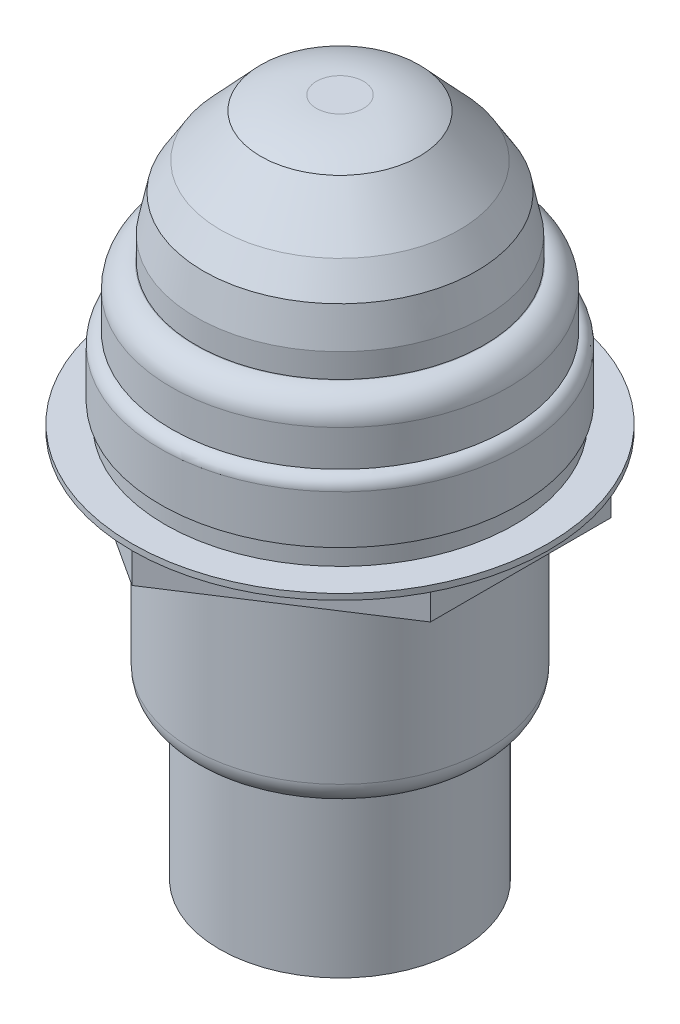
ISO-10303-21;
HEADER;
FILE_DESCRIPTION(('STEP AP214'),'2;1');
FILE_NAME('part.step','',(''),(''),'','','');
FILE_SCHEMA(('AUTOMOTIVE_DESIGN { 1 0 10303 214 1 1 1 1 }'));
ENDSEC;
DATA;
#1=APPLICATION_CONTEXT('core data for automotive mechanical design processes');
#2=APPLICATION_PROTOCOL_DEFINITION('international standard','automotive_design',2000,#1);
#3=PRODUCT_CONTEXT('',#1,'mechanical');
#4=PRODUCT('Part','Part','',(#3));
#5=PRODUCT_RELATED_PRODUCT_CATEGORY('part','',(#4));
#6=PRODUCT_DEFINITION_FORMATION('','',#4);
#7=PRODUCT_DEFINITION_CONTEXT('part definition',#1,'design');
#8=PRODUCT_DEFINITION('design','',#6,#7);
#9=PRODUCT_DEFINITION_SHAPE('','',#8);
#10=(LENGTH_UNIT() NAMED_UNIT(*) SI_UNIT(.MILLI.,.METRE.));
#11=(NAMED_UNIT(*) PLANE_ANGLE_UNIT() SI_UNIT($,.RADIAN.));
#12=(NAMED_UNIT(*) SI_UNIT($,.STERADIAN.) SOLID_ANGLE_UNIT());
#13=UNCERTAINTY_MEASURE_WITH_UNIT(LENGTH_MEASURE(1.E-05),#10,'distance_accuracy_value','');
#14=(GEOMETRIC_REPRESENTATION_CONTEXT(3) GLOBAL_UNCERTAINTY_ASSIGNED_CONTEXT((#13)) GLOBAL_UNIT_ASSIGNED_CONTEXT((#10,
#11,#12)) REPRESENTATION_CONTEXT('',''));
#15=CARTESIAN_POINT('',(0.,0.,0.));
#16=DIRECTION('',(0.,0.,1.));
#17=DIRECTION('',(1.,0.,0.));
#18=AXIS2_PLACEMENT_3D('',#15,#16,#17);
#19=CARTESIAN_POINT('',(0.,-12.3063,0.));
#20=DIRECTION('',(0.,-1.,0.));
#21=DIRECTION('',(0.,0.,-1.));
#22=AXIS2_PLACEMENT_3D('',#19,#20,#21);
#23=PLANE('',#22);
#24=DIRECTION('',(0.,0.,-1.));
#25=VECTOR('',#24,1.);
#26=CARTESIAN_POINT('',(-15.24,-12.3063,7.62));
#27=LINE('',#26,#25);
#28=CARTESIAN_POINT('',(-15.24,-12.3063,7.62));
#29=VERTEX_POINT('',#28);
#30=CARTESIAN_POINT('',(-15.24,-12.3063,-7.59799288356917));
#31=VERTEX_POINT('',#30);
#32=EDGE_CURVE('E55',#29,#31,#27,.T.);
#33=ORIENTED_EDGE('',*,*,#32,.F.);
#34=DIRECTION('',(-0.838443616300637,0.,-0.544988350595414));
#35=VECTOR('',#34,1.);
#36=CARTESIAN_POINT('',(-15.24,-12.3063,7.62));
#37=LINE('',#36,#35);
#38=CARTESIAN_POINT('',(0.,-12.3063,17.526));
#39=VERTEX_POINT('',#38);
#40=EDGE_CURVE('E138',#39,#29,#37,.T.);
#41=ORIENTED_EDGE('',*,*,#40,.F.);
#42=CARTESIAN_POINT('',(0.,-12.3063,0.));
#43=DIRECTION('',(0.,-1.,0.));
#44=DIRECTION('',(0.,0.,-1.));
#45=AXIS2_PLACEMENT_3D('',#42,#43,#44);
#46=CIRCLE('',#45,17.526);
#47=CARTESIAN_POINT('',(0.,-12.3063,-17.526));
#48=VERTEX_POINT('',#47);
#49=EDGE_CURVE('E144',#39,#48,#46,.T.);
#50=ORIENTED_EDGE('',*,*,#49,.T.);
#51=DIRECTION('',(0.837890310531416,0.,-0.545838646046217));
#52=VECTOR('',#51,1.);
#53=CARTESIAN_POINT('',(-15.24,-12.3063,-7.59799288356917));
#54=LINE('',#53,#52);
#55=EDGE_CURVE('E236',#31,#48,#54,.T.);
#56=ORIENTED_EDGE('',*,*,#55,.F.);
#57=EDGE_LOOP('',(#33,#41,#50,#56));
#58=FACE_BOUND('',#57,.T.);
#59=ADVANCED_FACE('F40',(#58),#23,.T.);
#60=CARTESIAN_POINT('',(0.,-10.16,0.));
#61=DIRECTION('',(0.,1.,0.));
#62=DIRECTION('',(0.,0.,1.));
#63=AXIS2_PLACEMENT_3D('',#60,#61,#62);
#64=CYLINDRICAL_SURFACE('',#63,15.1212575526819);
#65=DIRECTION('',(0.,1.,0.));
#66=VECTOR('',#65,1.);
#67=CARTESIAN_POINT('',(-15.1212575526819,-10.16,0.));
#68=LINE('',#67,#66);
#69=CARTESIAN_POINT('',(-15.1212575526819,-6.08903727939304,0.));
#70=VERTEX_POINT('',#69);
#71=CARTESIAN_POINT('',(-15.1212575526819,-10.16,0.));
#72=VERTEX_POINT('',#71);
#73=EDGE_CURVE('E182',#70,#72,#68,.F.);
#74=ORIENTED_EDGE('',*,*,#73,.F.);
#75=CARTESIAN_POINT('',(0.,-6.08903727939304,0.));
#76=DIRECTION('',(0.,1.,0.));
#77=DIRECTION('',(0.,0.,1.));
#78=AXIS2_PLACEMENT_3D('',#75,#76,#77);
#79=CIRCLE('',#78,15.1212575526819);
#80=CARTESIAN_POINT('',(-15.1207242212316,-6.08903727939304,0.127));
#81=VERTEX_POINT('',#80);
#82=EDGE_CURVE('E214',#70,#81,#79,.F.);
#83=ORIENTED_EDGE('',*,*,#82,.T.);
#84=DIRECTION('',(0.,1.,0.));
#85=VECTOR('',#84,1.);
#86=CARTESIAN_POINT('',(-15.1207242212316,-10.16,0.127));
#87=LINE('',#86,#85);
#88=CARTESIAN_POINT('',(-15.1207242212316,-10.16,0.127));
#89=VERTEX_POINT('',#88);
#90=EDGE_CURVE('E179',#89,#81,#87,.T.);
#91=ORIENTED_EDGE('',*,*,#90,.F.);
#92=CARTESIAN_POINT('',(0.,-10.16,0.));
#93=DIRECTION('',(0.,-1.,0.));
#94=DIRECTION('',(0.,0.,-1.));
#95=AXIS2_PLACEMENT_3D('',#92,#93,#94);
#96=CIRCLE('',#95,15.1212575526819);
#97=EDGE_CURVE('E184',#72,#89,#96,.T.);
#98=ORIENTED_EDGE('',*,*,#97,.F.);
#99=EDGE_LOOP('',(#74,#83,#91,#98));
#100=FACE_BOUND('',#99,.T.);
#101=ADVANCED_FACE('F282',(#100),#64,.T.);
#102=CARTESIAN_POINT('',(0.,-10.16,0.));
#103=DIRECTION('',(0.,-1.,0.));
#104=DIRECTION('',(0.,0.,-1.));
#105=AXIS2_PLACEMENT_3D('',#102,#103,#104);
#106=PLANE('',#105);
#107=CARTESIAN_POINT('',(0.,-10.16,0.));
#108=DIRECTION('',(0.,-1.,0.));
#109=DIRECTION('',(0.,0.,-1.));
#110=AXIS2_PLACEMENT_3D('',#107,#108,#109);
#111=CIRCLE('',#110,14.74025754);
#112=CARTESIAN_POINT('',(0.,-10.16,14.74025754));
#113=VERTEX_POINT('',#112);
#114=EDGE_CURVE('E156',#113,#113,#111,.T.);
#115=ORIENTED_EDGE('',*,*,#114,.F.);
#116=EDGE_LOOP('',(#115));
#117=FACE_BOUND('',#116,.T.);
#118=DIRECTION('',(0.,0.,-1.));
#119=VECTOR('',#118,1.);
#120=CARTESIAN_POINT('',(-14.986,-10.16,0.));
#121=LINE('',#120,#119);
#122=CARTESIAN_POINT('',(-14.986,-10.16,0.127));
#123=VERTEX_POINT('',#122);
#124=CARTESIAN_POINT('',(-14.986,-10.16,0.));
#125=VERTEX_POINT('',#124);
#126=EDGE_CURVE('E155',#123,#125,#121,.T.);
#127=ORIENTED_EDGE('',*,*,#126,.T.);
#128=DIRECTION('',(-1.,0.,0.));
#129=VECTOR('',#128,1.);
#130=CARTESIAN_POINT('',(-14.986,-10.16,0.));
#131=LINE('',#130,#129);
#132=EDGE_CURVE('E176',#125,#72,#131,.T.);
#133=ORIENTED_EDGE('',*,*,#132,.T.);
#134=ORIENTED_EDGE('',*,*,#97,.T.);
#135=DIRECTION('',(-1.,0.,0.));
#136=VECTOR('',#135,1.);
#137=CARTESIAN_POINT('',(-14.986,-10.16,0.127));
#138=LINE('',#137,#136);
#139=EDGE_CURVE('E169',#123,#89,#138,.T.);
#140=ORIENTED_EDGE('',*,*,#139,.F.);
#141=EDGE_LOOP('',(#127,#133,#134,#140));
#142=FACE_BOUND('',#141,.T.);
#143=ADVANCED_FACE('F286',(#117,#142),#106,.T.);
#144=CARTESIAN_POINT('',(0.,6.096,0.));
#145=DIRECTION('',(0.,-1.,0.));
#146=DIRECTION('',(0.,0.,-1.));
#147=AXIS2_PLACEMENT_3D('',#144,#145,#146);
#148=CONICAL_SURFACE('',#147,11.2929938121503,0.205758423033744);
#149=CARTESIAN_POINT('',(0.,2.03199999999999,0.));
#150=DIRECTION('',(0.,-1.,0.));
#151=DIRECTION('',(0.,0.,-1.));
#152=AXIS2_PLACEMENT_3D('',#149,#150,#151);
#153=CIRCLE('',#152,12.1412);
#154=CARTESIAN_POINT('',(0.,2.03199999999998,-12.1412));
#155=VERTEX_POINT('',#154);
#156=EDGE_CURVE('E193',#155,#155,#153,.T.);
#157=ORIENTED_EDGE('',*,*,#156,.F.);
#158=EDGE_LOOP('',(#157));
#159=FACE_BOUND('',#158,.T.);
#160=CARTESIAN_POINT('',(0.,5.07741090713945,0.));
#161=DIRECTION('',(0.,-1.,0.));
#162=DIRECTION('',(0.,0.,-1.));
#163=AXIS2_PLACEMENT_3D('',#160,#161,#162);
#164=CIRCLE('',#163,11.5055857342567);
#165=CARTESIAN_POINT('',(0.,5.07741090713944,-11.5055857342567));
#166=VERTEX_POINT('',#165);
#167=EDGE_CURVE('E190',#166,#166,#164,.F.);
#168=ORIENTED_EDGE('',*,*,#167,.F.);
#169=EDGE_LOOP('',(#168));
#170=FACE_BOUND('',#169,.T.);
#171=ADVANCED_FACE('F438',(#159,#170),#148,.T.);
#172=CARTESIAN_POINT('',(0.,12.192,0.));
#173=DIRECTION('',(0.,-1.,0.));
#174=DIRECTION('',(0.,0.,-1.));
#175=AXIS2_PLACEMENT_3D('',#172,#173,#174);
#176=CYLINDRICAL_SURFACE('',#175,12.1412);
#177=CARTESIAN_POINT('',(0.,0.,0.));
#178=DIRECTION('',(0.,1.,0.));
#179=DIRECTION('',(0.,0.,1.));
#180=AXIS2_PLACEMENT_3D('',#177,#178,#179);
#181=CIRCLE('',#180,12.1412);
#182=CARTESIAN_POINT('',(0.,0.,-12.1412));
#183=VERTEX_POINT('',#182);
#184=EDGE_CURVE('E202',#183,#183,#181,.T.);
#185=CARTESIAN_POINT('',(0.,2.03199999999998,-12.1412));
#186=CARTESIAN_POINT('',(0.,2.01083333333332,-12.1412));
#187=CARTESIAN_POINT('',(0.,1.98966666666665,-12.1412));
#188=CARTESIAN_POINT('',(0.,1.94733333333332,-12.1412));
#189=CARTESIAN_POINT('',(0.,1.92616666666665,-12.1412));
#190=CARTESIAN_POINT('',(0.,1.88383333333332,-12.1412));
#191=CARTESIAN_POINT('',(0.,1.86266666666665,-12.1412));
#192=CARTESIAN_POINT('',(0.,1.82033333333332,-12.1412));
#193=CARTESIAN_POINT('',(0.,1.79916666666665,-12.1412));
#194=CARTESIAN_POINT('',(0.,1.75683333333332,-12.1412));
#195=CARTESIAN_POINT('',(0.,1.73566666666665,-12.1412));
#196=CARTESIAN_POINT('',(0.,1.69333333333332,-12.1412));
#197=CARTESIAN_POINT('',(0.,1.67216666666665,-12.1412));
#198=CARTESIAN_POINT('',(0.,1.62983333333332,-12.1412));
#199=CARTESIAN_POINT('',(0.,1.60866666666665,-12.1412));
#200=CARTESIAN_POINT('',(0.,1.56633333333332,-12.1412));
#201=CARTESIAN_POINT('',(0.,1.54516666666665,-12.1412));
#202=CARTESIAN_POINT('',(0.,1.50283333333332,-12.1412));
#203=CARTESIAN_POINT('',(0.,1.48166666666665,-12.1412));
#204=CARTESIAN_POINT('',(0.,1.43933333333332,-12.1412));
#205=CARTESIAN_POINT('',(0.,1.41816666666665,-12.1412));
#206=CARTESIAN_POINT('',(0.,1.37583333333332,-12.1412));
#207=CARTESIAN_POINT('',(0.,1.35466666666665,-12.1412));
#208=CARTESIAN_POINT('',(0.,1.31233333333332,-12.1412));
#209=CARTESIAN_POINT('',(0.,1.29116666666665,-12.1412));
#210=CARTESIAN_POINT('',(0.,1.24883333333332,-12.1412));
#211=CARTESIAN_POINT('',(0.,1.22766666666666,-12.1412));
#212=CARTESIAN_POINT('',(0.,1.18533333333332,-12.1412));
#213=CARTESIAN_POINT('',(0.,1.16416666666666,-12.1412));
#214=CARTESIAN_POINT('',(0.,1.12183333333332,-12.1412));
#215=CARTESIAN_POINT('',(0.,1.10066666666666,-12.1412));
#216=CARTESIAN_POINT('',(0.,1.05833333333332,-12.1412));
#217=CARTESIAN_POINT('',(0.,1.03716666666666,-12.1412));
#218=CARTESIAN_POINT('',(0.,0.994833333333324,-12.1412));
#219=CARTESIAN_POINT('',(0.,0.973666666666658,-12.1412));
#220=CARTESIAN_POINT('',(0.,0.931333333333325,-12.1412));
#221=CARTESIAN_POINT('',(0.,0.910166666666659,-12.1412));
#222=CARTESIAN_POINT('',(0.,0.867833333333326,-12.1412));
#223=CARTESIAN_POINT('',(0.,0.846666666666659,-12.1412));
#224=CARTESIAN_POINT('',(0.,0.804333333333326,-12.1412));
#225=CARTESIAN_POINT('',(0.,0.78316666666666,-12.1412));
#226=CARTESIAN_POINT('',(0.,0.740833333333327,-12.1412));
#227=CARTESIAN_POINT('',(0.,0.719666666666661,-12.1412));
#228=CARTESIAN_POINT('',(0.,0.677333333333328,-12.1412));
#229=CARTESIAN_POINT('',(0.,0.656166666666661,-12.1412));
#230=CARTESIAN_POINT('',(0.,0.613833333333329,-12.1412));
#231=CARTESIAN_POINT('',(0.,0.592666666666662,-12.1412));
#232=CARTESIAN_POINT('',(0.,0.550333333333329,-12.1412));
#233=CARTESIAN_POINT('',(0.,0.529166666666662,-12.1412));
#234=CARTESIAN_POINT('',(0.,0.486833333333329,-12.1412));
#235=CARTESIAN_POINT('',(0.,0.465666666666663,-12.1412));
#236=CARTESIAN_POINT('',(0.,0.42333333333333,-12.1412));
#237=CARTESIAN_POINT('',(0.,0.402166666666663,-12.1412));
#238=CARTESIAN_POINT('',(0.,0.359833333333329,-12.1412));
#239=CARTESIAN_POINT('',(0.,0.338666666666663,-12.1412));
#240=CARTESIAN_POINT('',(0.,0.29633333333333,-12.1412));
#241=CARTESIAN_POINT('',(0.,0.275166666666664,-12.1412));
#242=CARTESIAN_POINT('',(0.,0.232833333333331,-12.1412));
#243=CARTESIAN_POINT('',(0.,0.211666666666664,-12.1412));
#244=CARTESIAN_POINT('',(0.,0.169333333333332,-12.1412));
#245=CARTESIAN_POINT('',(0.,0.148166666666665,-12.1412));
#246=CARTESIAN_POINT('',(0.,0.105833333333332,-12.1412));
#247=CARTESIAN_POINT('',(0.,0.0846666666666658,-12.1412));
#248=CARTESIAN_POINT('',(0.,0.0423333333333329,-12.1412));
#249=CARTESIAN_POINT('',(0.,0.0211666666666664,-12.1412));
#250=CARTESIAN_POINT('',(0.,0.,-12.1412));
#251=B_SPLINE_CURVE_WITH_KNOTS('',3,(#185,#186,#187,#188,#189,#190,#191,#192,#193,#194,#195,
#196,#197,#198,#199,#200,#201,#202,#203,#204,#205,#206,#207,#208,#209,#210,#211,#212,#213,#214,
#215,#216,#217,#218,#219,#220,#221,#222,#223,#224,#225,#226,#227,#228,#229,#230,#231,#232,#233,
#234,#235,#236,#237,#238,#239,#240,#241,#242,#243,#244,#245,#246,#247,#248,#249,#250),
.UNSPECIFIED.,.F.,.F.,(4,2,2,2,2,2,2,2,2,2,2,2,2,2,2,2,2,2,2,2,2,2,2,2,2,2,2,2,2,2,2,2,4),(0.,
0.0634999999999993,0.126999999999999,0.190499999999998,0.253999999999997,0.317499999999997,
0.380999999999996,0.444499999999995,0.507999999999995,0.571499999999996,0.634999999999995,
0.698499999999994,0.761999999999994,0.825499999999993,0.888999999999992,0.952499999999992,
1.01599999999999,1.07949999999999,1.14299999999999,1.20649999999999,1.26999999999999,
1.33349999999999,1.39699999999999,1.46049999999999,1.52399999999999,1.58749999999998,
1.65099999999999,1.71449999999999,1.77799999999998,1.84149999999998,1.90499999999998,
1.96849999999998,2.03199999999998),.UNSPECIFIED.);
#252=EDGE_CURVE('BSEAM528',#155,#183,#251,.T.);
#253=ORIENTED_EDGE('',*,*,#156,.T.);
#254=ORIENTED_EDGE('',*,*,#184,.T.);
#255=ORIENTED_EDGE('',*,*,#252,.T.);
#256=ORIENTED_EDGE('',*,*,#252,.F.);
#257=EDGE_LOOP('',(#253,#255,#254,#256));
#258=FACE_BOUND('',#257,.T.);
#259=ADVANCED_FACE('F528',(#258),#176,.T.);
#260=CARTESIAN_POINT('',(0.,-5.08,0.));
#261=DIRECTION('',(0.,1.,0.));
#262=DIRECTION('',(0.,0.,1.));
#263=AXIS2_PLACEMENT_3D('',#260,#261,#262);
#264=CYLINDRICAL_SURFACE('',#263,14.224);
#265=CARTESIAN_POINT('',(0.,-2.032,0.));
#266=DIRECTION('',(0.,-1.,0.));
#267=DIRECTION('',(0.,0.,-1.));
#268=AXIS2_PLACEMENT_3D('',#265,#266,#267);
#269=CIRCLE('',#268,14.224);
#270=CARTESIAN_POINT('',(0.,-2.032,-14.224));
#271=VERTEX_POINT('',#270);
#272=EDGE_CURVE('E208',#271,#271,#269,.T.);
#273=ORIENTED_EDGE('',*,*,#272,.T.);
#274=EDGE_LOOP('',(#273));
#275=FACE_BOUND('',#274,.T.);
#276=CARTESIAN_POINT('',(0.,-5.08,0.));
#277=DIRECTION('',(0.,-1.,0.));
#278=DIRECTION('',(0.,0.,-1.));
#279=AXIS2_PLACEMENT_3D('',#276,#277,#278);
#280=CIRCLE('',#279,14.224);
#281=CARTESIAN_POINT('',(0.,-5.08,-14.224));
#282=VERTEX_POINT('',#281);
#283=EDGE_CURVE('E199',#282,#282,#280,.T.);
#284=ORIENTED_EDGE('',*,*,#283,.F.);
#285=EDGE_LOOP('',(#284));
#286=FACE_BOUND('',#285,.T.);
#287=ADVANCED_FACE('F516',(#275,#286),#264,.T.);
#288=CARTESIAN_POINT('',(0.,0.,0.));
#289=DIRECTION('',(0.,-1.,0.));
#290=DIRECTION('',(0.,0.,-1.));
#291=AXIS2_PLACEMENT_3D('',#288,#289,#290);
#292=PLANE('',#291);
#293=CARTESIAN_POINT('',(0.,0.,0.));
#294=DIRECTION('',(0.,-1.,0.));
#295=DIRECTION('',(0.,0.,-1.));
#296=AXIS2_PLACEMENT_3D('',#293,#294,#295);
#297=CIRCLE('',#296,12.192);
#298=CARTESIAN_POINT('',(0.,0.,-12.192));
#299=VERTEX_POINT('',#298);
#300=EDGE_CURVE('E211',#299,#299,#297,.F.);
#301=ORIENTED_EDGE('',*,*,#300,.T.);
#302=EDGE_LOOP('',(#301));
#303=FACE_BOUND('',#302,.T.);
#304=ORIENTED_EDGE('',*,*,#184,.F.);
#305=EDGE_LOOP('',(#304));
#306=FACE_BOUND('',#305,.T.);
#307=ADVANCED_FACE('F510',(#303,#306),#292,.F.);
#308=CARTESIAN_POINT('',(0.,4.50457584567905,0.));
#309=DIRECTION('',(0.,-1.,0.));
#310=DIRECTION('',(0.,0.,-1.));
#311=AXIS2_PLACEMENT_3D('',#308,#309,#310);
#312=CONICAL_SURFACE('',#311,11.8571980709881,0.550512644367805);
#313=CARTESIAN_POINT('',(0.,7.38930020271738,0.));
#314=DIRECTION('',(0.,-1.,0.));
#315=DIRECTION('',(0.,0.,-1.));
#316=AXIS2_PLACEMENT_3D('',#313,#314,#315);
#317=CIRCLE('',#316,10.0865231590539);
#318=CARTESIAN_POINT('',(0.,7.38930020271738,-10.0865231590539));
#319=VERTEX_POINT('',#318);
#320=EDGE_CURVE('E187',#319,#319,#317,.T.);
#321=ORIENTED_EDGE('',*,*,#320,.T.);
#322=EDGE_LOOP('',(#321));
#323=FACE_BOUND('',#322,.T.);
#324=ORIENTED_EDGE('',*,*,#167,.T.);
#325=EDGE_LOOP('',(#324));
#326=FACE_BOUND('',#325,.T.);
#327=ADVANCED_FACE('F515',(#323,#326),#312,.T.);
#328=CARTESIAN_POINT('',(0.,12.192,0.));
#329=DIRECTION('',(0.,1.,0.));
#330=DIRECTION('',(0.,0.,1.));
#331=AXIS2_PLACEMENT_3D('',#328,#329,#330);
#332=PLANE('',#331);
#333=CARTESIAN_POINT('',(0.,12.192,0.));
#334=DIRECTION('',(0.,1.,0.));
#335=DIRECTION('',(0.,0.,1.));
#336=AXIS2_PLACEMENT_3D('',#333,#334,#335);
#337=CIRCLE('',#336,1.9812);
#338=CARTESIAN_POINT('',(0.,12.192,1.9812));
#339=VERTEX_POINT('',#338);
#340=EDGE_CURVE('E205',#339,#339,#337,.T.);
#341=ORIENTED_EDGE('',*,*,#340,.T.);
#342=EDGE_LOOP('',(#341));
#343=FACE_BOUND('',#342,.T.);
#344=ADVANCED_FACE('F549',(#343),#332,.T.);
#345=CARTESIAN_POINT('',(0.,2.032,0.));
#346=DIRECTION('',(0.,1.,0.));
#347=DIRECTION('',(0.,0.,1.));
#348=AXIS2_PLACEMENT_3D('',#345,#346,#347);
#349=DEGENERATE_TOROIDAL_SURFACE('',#348,1.9812,10.16,.T.);
#350=CARTESIAN_POINT('',(0.,11.0393652625857,0.));
#351=DIRECTION('',(0.,-1.,0.));
#352=DIRECTION('',(0.,0.,-1.));
#353=AXIS2_PLACEMENT_3D('',#350,#351,#352);
#354=CIRCLE('',#353,6.68151605600777);
#355=CARTESIAN_POINT('',(0.,11.0393652625857,-6.68151605600777));
#356=VERTEX_POINT('',#355);
#357=EDGE_CURVE('E196',#356,#356,#354,.T.);
#358=ORIENTED_EDGE('',*,*,#357,.F.);
#359=EDGE_LOOP('',(#358));
#360=FACE_BOUND('',#359,.T.);
#361=ORIENTED_EDGE('',*,*,#340,.F.);
#362=EDGE_LOOP('',(#361));
#363=FACE_BOUND('',#362,.T.);
#364=ADVANCED_FACE('F539',(#360,#363),#349,.T.);
#365=CARTESIAN_POINT('',(0.,11.0393652625857,0.));
#366=DIRECTION('',(0.,-1.,0.));
#367=DIRECTION('',(0.,0.,-1.));
#368=AXIS2_PLACEMENT_3D('',#365,#366,#367);
#369=CONICAL_SURFACE('',#368,6.68151605600777,0.750677119213072);
#370=ORIENTED_EDGE('',*,*,#357,.T.);
#371=EDGE_LOOP('',(#370));
#372=FACE_BOUND('',#371,.T.);
#373=ORIENTED_EDGE('',*,*,#320,.F.);
#374=EDGE_LOOP('',(#373));
#375=FACE_BOUND('',#374,.T.);
#376=ADVANCED_FACE('F502',(#372,#375),#369,.T.);
#377=CARTESIAN_POINT('',(0.,-2.032,0.));
#378=DIRECTION('',(0.,-1.,0.));
#379=DIRECTION('',(0.,0.,-1.));
#380=AXIS2_PLACEMENT_3D('',#377,#378,#379);
#381=TOROIDAL_SURFACE('',#380,12.192,2.032);
#382=ORIENTED_EDGE('',*,*,#300,.F.);
#383=EDGE_LOOP('',(#382));
#384=FACE_BOUND('',#383,.T.);
#385=ORIENTED_EDGE('',*,*,#272,.F.);
#386=EDGE_LOOP('',(#385));
#387=FACE_BOUND('',#386,.T.);
#388=ADVANCED_FACE('F488',(#384,#387),#381,.T.);
#389=CARTESIAN_POINT('',(0.,-6.08903727939304,0.));
#390=DIRECTION('',(0.,1.,0.));
#391=DIRECTION('',(0.,0.,1.));
#392=AXIS2_PLACEMENT_3D('',#389,#390,#391);
#393=TOROIDAL_SURFACE('',#392,14.1052575526819,1.016);
#394=ORIENTED_EDGE('',*,*,#283,.T.);
#395=EDGE_LOOP('',(#394));
#396=FACE_BOUND('',#395,.T.);
#397=EDGE_CURVE('E160',#81,#70,#79,.F.);
#398=ORIENTED_EDGE('',*,*,#397,.F.);
#399=ORIENTED_EDGE('',*,*,#82,.F.);
#400=EDGE_LOOP('',(#398,#399));
#401=FACE_BOUND('',#400,.T.);
#402=ADVANCED_FACE('F479',(#396,#401),#393,.T.);
#403=CARTESIAN_POINT('',(-14.986,-6.08903727939304,0.));
#404=DIRECTION('',(0.,0.,1.));
#405=DIRECTION('',(1.,0.,0.));
#406=AXIS2_PLACEMENT_3D('',#403,#404,#405);
#407=PLANE('',#406);
#408=ORIENTED_EDGE('',*,*,#73,.T.);
#409=ORIENTED_EDGE('',*,*,#132,.F.);
#410=DIRECTION('',(0.,1.,0.));
#411=VECTOR('',#410,1.);
#412=CARTESIAN_POINT('',(-14.986,-6.08903727939304,0.));
#413=LINE('',#412,#411);
#414=CARTESIAN_POINT('',(-14.986,-6.08903727939304,0.));
#415=VERTEX_POINT('',#414);
#416=EDGE_CURVE('E163',#125,#415,#413,.T.);
#417=ORIENTED_EDGE('',*,*,#416,.T.);
#418=DIRECTION('',(-1.,0.,0.));
#419=VECTOR('',#418,1.);
#420=CARTESIAN_POINT('',(-14.986,-6.08903727939304,0.));
#421=LINE('',#420,#419);
#422=EDGE_CURVE('E173',#415,#70,#421,.T.);
#423=ORIENTED_EDGE('',*,*,#422,.T.);
#424=EDGE_LOOP('',(#408,#409,#417,#423));
#425=FACE_BOUND('',#424,.T.);
#426=ADVANCED_FACE('F469',(#425),#407,.T.);
#427=CARTESIAN_POINT('',(-14.986,-10.16,0.127));
#428=DIRECTION('',(0.,0.,-1.));
#429=DIRECTION('',(-1.,0.,0.));
#430=AXIS2_PLACEMENT_3D('',#427,#428,#429);
#431=PLANE('',#430);
#432=ORIENTED_EDGE('',*,*,#90,.T.);
#433=DIRECTION('',(-1.,0.,0.));
#434=VECTOR('',#433,1.);
#435=CARTESIAN_POINT('',(-14.986,-6.08903727939304,0.127));
#436=LINE('',#435,#434);
#437=CARTESIAN_POINT('',(-14.986,-6.08903727939304,0.127));
#438=VERTEX_POINT('',#437);
#439=EDGE_CURVE('E171',#438,#81,#436,.T.);
#440=ORIENTED_EDGE('',*,*,#439,.F.);
#441=DIRECTION('',(0.,-1.,0.));
#442=VECTOR('',#441,1.);
#443=CARTESIAN_POINT('',(-14.986,-10.16,0.127));
#444=LINE('',#443,#442);
#445=EDGE_CURVE('E167',#438,#123,#444,.T.);
#446=ORIENTED_EDGE('',*,*,#445,.T.);
#447=ORIENTED_EDGE('',*,*,#139,.T.);
#448=EDGE_LOOP('',(#432,#440,#446,#447));
#449=FACE_BOUND('',#448,.T.);
#450=ADVANCED_FACE('F459',(#449),#431,.T.);
#451=CARTESIAN_POINT('',(-14.986,-6.08903727939304,0.127));
#452=DIRECTION('',(0.,-1.,0.));
#453=DIRECTION('',(0.,0.,-1.));
#454=AXIS2_PLACEMENT_3D('',#451,#452,#453);
#455=PLANE('',#454);
#456=ORIENTED_EDGE('',*,*,#422,.F.);
#457=DIRECTION('',(0.,0.,1.));
#458=VECTOR('',#457,1.);
#459=CARTESIAN_POINT('',(-14.986,-6.08903727939304,0.127));
#460=LINE('',#459,#458);
#461=EDGE_CURVE('E165',#415,#438,#460,.T.);
#462=ORIENTED_EDGE('',*,*,#461,.T.);
#463=ORIENTED_EDGE('',*,*,#439,.T.);
#464=ORIENTED_EDGE('',*,*,#397,.T.);
#465=EDGE_LOOP('',(#456,#462,#463,#464));
#466=FACE_BOUND('',#465,.T.);
#467=ADVANCED_FACE('F449',(#466),#455,.T.);
#468=CARTESIAN_POINT('',(-14.986,0.,0.));
#469=DIRECTION('',(-1.,0.,0.));
#470=DIRECTION('',(0.,0.,1.));
#471=AXIS2_PLACEMENT_3D('',#468,#469,#470);
#472=PLANE('',#471);
#473=ORIENTED_EDGE('',*,*,#126,.F.);
#474=ORIENTED_EDGE('',*,*,#445,.F.);
#475=ORIENTED_EDGE('',*,*,#461,.F.);
#476=ORIENTED_EDGE('',*,*,#416,.F.);
#477=EDGE_LOOP('',(#473,#474,#475,#476));
#478=FACE_BOUND('',#477,.T.);
#479=ADVANCED_FACE('F426',(#478),#472,.T.);
#480=CARTESIAN_POINT('',(0.,-11.7983,0.));
#481=DIRECTION('',(0.,1.,0.));
#482=DIRECTION('',(0.,0.,1.));
#483=AXIS2_PLACEMENT_3D('',#480,#481,#482);
#484=CYLINDRICAL_SURFACE('',#483,14.74025754);
#485=CARTESIAN_POINT('',(0.,-11.7983,0.));
#486=DIRECTION('',(0.,-1.,0.));
#487=DIRECTION('',(0.,0.,-1.));
#488=AXIS2_PLACEMENT_3D('',#485,#486,#487);
#489=CIRCLE('',#488,14.74025754);
#490=CARTESIAN_POINT('',(0.,-11.7983,14.74025754));
#491=VERTEX_POINT('',#490);
#492=EDGE_CURVE('E151',#491,#491,#489,.T.);
#493=CARTESIAN_POINT('',(0.,-11.7983,14.74025754));
#494=CARTESIAN_POINT('',(0.,-11.781234375,14.74025754));
#495=CARTESIAN_POINT('',(0.,-11.76416875,14.74025754));
#496=CARTESIAN_POINT('',(0.,-11.7300375,14.74025754));
#497=CARTESIAN_POINT('',(0.,-11.712971875,14.74025754));
#498=CARTESIAN_POINT('',(0.,-11.678840625,14.74025754));
#499=CARTESIAN_POINT('',(0.,-11.661775,14.74025754));
#500=CARTESIAN_POINT('',(0.,-11.62764375,14.74025754));
#501=CARTESIAN_POINT('',(0.,-11.610578125,14.74025754));
#502=CARTESIAN_POINT('',(0.,-11.576446875,14.74025754));
#503=CARTESIAN_POINT('',(0.,-11.55938125,14.74025754));
#504=CARTESIAN_POINT('',(0.,-11.52525,14.74025754));
#505=CARTESIAN_POINT('',(0.,-11.508184375,14.74025754));
#506=CARTESIAN_POINT('',(0.,-11.474053125,14.74025754));
#507=CARTESIAN_POINT('',(0.,-11.4569875,14.74025754));
#508=CARTESIAN_POINT('',(0.,-11.42285625,14.74025754));
#509=CARTESIAN_POINT('',(0.,-11.405790625,14.74025754));
#510=CARTESIAN_POINT('',(0.,-11.371659375,14.74025754));
#511=CARTESIAN_POINT('',(0.,-11.35459375,14.74025754));
#512=CARTESIAN_POINT('',(0.,-11.3204625,14.74025754));
#513=CARTESIAN_POINT('',(0.,-11.303396875,14.74025754));
#514=CARTESIAN_POINT('',(0.,-11.269265625,14.74025754));
#515=CARTESIAN_POINT('',(0.,-11.2522,14.74025754));
#516=CARTESIAN_POINT('',(0.,-11.21806875,14.74025754));
#517=CARTESIAN_POINT('',(0.,-11.201003125,14.74025754));
#518=CARTESIAN_POINT('',(0.,-11.166871875,14.74025754));
#519=CARTESIAN_POINT('',(0.,-11.14980625,14.74025754));
#520=CARTESIAN_POINT('',(0.,-11.115675,14.74025754));
#521=CARTESIAN_POINT('',(0.,-11.098609375,14.74025754));
#522=CARTESIAN_POINT('',(0.,-11.064478125,14.74025754));
#523=CARTESIAN_POINT('',(0.,-11.0474125,14.74025754));
#524=CARTESIAN_POINT('',(0.,-11.01328125,14.74025754));
#525=CARTESIAN_POINT('',(0.,-10.996215625,14.74025754));
#526=CARTESIAN_POINT('',(0.,-10.962084375,14.74025754));
#527=CARTESIAN_POINT('',(0.,-10.94501875,14.74025754));
#528=CARTESIAN_POINT('',(0.,-10.9108875,14.74025754));
#529=CARTESIAN_POINT('',(0.,-10.893821875,14.74025754));
#530=CARTESIAN_POINT('',(0.,-10.859690625,14.74025754));
#531=CARTESIAN_POINT('',(0.,-10.842625,14.74025754));
#532=CARTESIAN_POINT('',(0.,-10.80849375,14.74025754));
#533=CARTESIAN_POINT('',(0.,-10.791428125,14.74025754));
#534=CARTESIAN_POINT('',(0.,-10.757296875,14.74025754));
#535=CARTESIAN_POINT('',(0.,-10.74023125,14.74025754));
#536=CARTESIAN_POINT('',(0.,-10.7061,14.74025754));
#537=CARTESIAN_POINT('',(0.,-10.689034375,14.74025754));
#538=CARTESIAN_POINT('',(0.,-10.654903125,14.74025754));
#539=CARTESIAN_POINT('',(0.,-10.6378375,14.74025754));
#540=CARTESIAN_POINT('',(0.,-10.60370625,14.74025754));
#541=CARTESIAN_POINT('',(0.,-10.586640625,14.74025754));
#542=CARTESIAN_POINT('',(0.,-10.552509375,14.74025754));
#543=CARTESIAN_POINT('',(0.,-10.53544375,14.74025754));
#544=CARTESIAN_POINT('',(0.,-10.5013125,14.74025754));
#545=CARTESIAN_POINT('',(0.,-10.484246875,14.74025754));
#546=CARTESIAN_POINT('',(0.,-10.450115625,14.74025754));
#547=CARTESIAN_POINT('',(0.,-10.43305,14.74025754));
#548=CARTESIAN_POINT('',(0.,-10.39891875,14.74025754));
#549=CARTESIAN_POINT('',(0.,-10.381853125,14.74025754));
#550=CARTESIAN_POINT('',(0.,-10.347721875,14.74025754));
#551=CARTESIAN_POINT('',(0.,-10.33065625,14.74025754));
#552=CARTESIAN_POINT('',(0.,-10.296525,14.74025754));
#553=CARTESIAN_POINT('',(0.,-10.279459375,14.74025754));
#554=CARTESIAN_POINT('',(0.,-10.245328125,14.74025754));
#555=CARTESIAN_POINT('',(0.,-10.2282625,14.74025754));
#556=CARTESIAN_POINT('',(0.,-10.19413125,14.74025754));
#557=CARTESIAN_POINT('',(0.,-10.177065625,14.74025754));
#558=CARTESIAN_POINT('',(0.,-10.16,14.74025754));
#559=B_SPLINE_CURVE_WITH_KNOTS('',3,(#493,#494,#495,#496,#497,#498,#499,#500,#501,#502,#503,
#504,#505,#506,#507,#508,#509,#510,#511,#512,#513,#514,#515,#516,#517,#518,#519,#520,#521,#522,
#523,#524,#525,#526,#527,#528,#529,#530,#531,#532,#533,#534,#535,#536,#537,#538,#539,#540,#541,
#542,#543,#544,#545,#546,#547,#548,#549,#550,#551,#552,#553,#554,#555,#556,#557,#558),
.UNSPECIFIED.,.F.,.F.,(4,2,2,2,2,2,2,2,2,2,2,2,2,2,2,2,2,2,2,2,2,2,2,2,2,2,2,2,2,2,2,2,4),(0.,
0.0511968749999994,0.102393749999999,0.153590625,0.204787499999999,0.255984374999999,0.30718125,
0.358378124999999,0.409574999999999,0.460771875,0.511968749999999,0.563165624999999,0.6143625,
0.665559374999999,0.716756249999999,0.767953125,0.819149999999999,0.870346874999999,0.92154375,
0.972740624999999,1.0239375,1.075134375,1.12633125,1.177528125,1.228725,1.279921875,1.33111875,
1.382315625,1.4335125,1.484709375,1.53590625,1.587103125,1.6383),.UNSPECIFIED.);
#560=EDGE_CURVE('BSEAM267',#491,#113,#559,.T.);
#561=ORIENTED_EDGE('',*,*,#492,.F.);
#562=ORIENTED_EDGE('',*,*,#114,.T.);
#563=ORIENTED_EDGE('',*,*,#560,.T.);
#564=ORIENTED_EDGE('',*,*,#560,.F.);
#565=EDGE_LOOP('',(#561,#563,#562,#564));
#566=FACE_BOUND('',#565,.T.);
#567=ADVANCED_FACE('F267',(#566),#484,.T.);
#568=CARTESIAN_POINT('',(0.,-12.3063,0.));
#569=DIRECTION('',(0.,1.,0.));
#570=DIRECTION('',(0.,0.,1.));
#571=AXIS2_PLACEMENT_3D('',#568,#569,#570);
#572=CYLINDRICAL_SURFACE('',#571,17.526);
#573=EDGE_CURVE('E150',#48,#39,#46,.T.);
#574=ORIENTED_EDGE('',*,*,#573,.F.);
#575=ORIENTED_EDGE('',*,*,#49,.F.);
#576=EDGE_LOOP('',(#574,#575));
#577=FACE_BOUND('',#576,.T.);
#578=CARTESIAN_POINT('',(0.,-11.7983,0.));
#579=DIRECTION('',(0.,-1.,0.));
#580=DIRECTION('',(0.,0.,-1.));
#581=AXIS2_PLACEMENT_3D('',#578,#579,#580);
#582=CIRCLE('',#581,17.526);
#583=CARTESIAN_POINT('',(0.,-11.7983,-17.526));
#584=VERTEX_POINT('',#583);
#585=EDGE_CURVE('E141',#584,#584,#582,.T.);
#586=ORIENTED_EDGE('',*,*,#585,.T.);
#587=EDGE_LOOP('',(#586));
#588=FACE_BOUND('',#587,.T.);
#589=ADVANCED_FACE('F264',(#577,#588),#572,.T.);
#590=DIRECTION('',(-0.838443616300637,0.,0.544988350595414));
#591=VECTOR('',#590,1.);
#592=CARTESIAN_POINT('',(15.24,-12.3063,7.62));
#593=LINE('',#592,#591);
#594=CARTESIAN_POINT('',(15.24,-12.3063,7.62));
#595=VERTEX_POINT('',#594);
#596=EDGE_CURVE('E63',#595,#39,#593,.T.);
#597=ORIENTED_EDGE('',*,*,#596,.F.);
#598=DIRECTION('',(0.,0.,1.));
#599=VECTOR('',#598,1.);
#600=CARTESIAN_POINT('',(15.24,-12.3063,7.62));
#601=LINE('',#600,#599);
#602=CARTESIAN_POINT('',(15.24,-12.3063,-7.59799288356917));
#603=VERTEX_POINT('',#602);
#604=EDGE_CURVE('E241',#603,#595,#601,.T.);
#605=ORIENTED_EDGE('',*,*,#604,.F.);
#606=DIRECTION('',(0.837890310531416,0.,0.545838646046217));
#607=VECTOR('',#606,1.);
#608=CARTESIAN_POINT('',(15.24,-12.3063,-7.59799288356917));
#609=LINE('',#608,#607);
#610=EDGE_CURVE('E238',#48,#603,#609,.T.);
#611=ORIENTED_EDGE('',*,*,#610,.F.);
#612=ORIENTED_EDGE('',*,*,#573,.T.);
#613=EDGE_LOOP('',(#597,#605,#611,#612));
#614=FACE_BOUND('',#613,.T.);
#615=ADVANCED_FACE('F260',(#614),#23,.T.);
#616=CARTESIAN_POINT('',(0.,-11.7983,0.));
#617=DIRECTION('',(0.,-1.,0.));
#618=DIRECTION('',(0.,0.,-1.));
#619=AXIS2_PLACEMENT_3D('',#616,#617,#618);
#620=PLANE('',#619);
#621=ORIENTED_EDGE('',*,*,#492,.T.);
#622=EDGE_LOOP('',(#621));
#623=FACE_BOUND('',#622,.T.);
#624=ORIENTED_EDGE('',*,*,#585,.F.);
#625=EDGE_LOOP('',(#624));
#626=FACE_BOUND('',#625,.T.);
#627=ADVANCED_FACE('F271',(#623,#626),#620,.F.);
#628=CARTESIAN_POINT('',(-15.24,-14.8463,7.62));
#629=DIRECTION('',(1.,0.,0.));
#630=DIRECTION('',(0.,0.,-1.));
#631=AXIS2_PLACEMENT_3D('',#628,#629,#630);
#632=PLANE('',#631);
#633=ORIENTED_EDGE('',*,*,#32,.T.);
#634=DIRECTION('',(0.,1.,0.));
#635=VECTOR('',#634,1.);
#636=CARTESIAN_POINT('',(-15.24,-14.8463,-7.59799288356917));
#637=LINE('',#636,#635);
#638=CARTESIAN_POINT('',(-15.24,-14.8463,-7.59799288356917));
#639=VERTEX_POINT('',#638);
#640=EDGE_CURVE('E123',#639,#31,#637,.T.);
#641=ORIENTED_EDGE('',*,*,#640,.F.);
#642=DIRECTION('',(0.,0.,-1.));
#643=VECTOR('',#642,1.);
#644=CARTESIAN_POINT('',(-15.24,-14.8463,7.62));
#645=LINE('',#644,#643);
#646=CARTESIAN_POINT('',(-15.24,-14.8463,7.62));
#647=VERTEX_POINT('',#646);
#648=EDGE_CURVE('E129',#647,#639,#645,.T.);
#649=ORIENTED_EDGE('',*,*,#648,.F.);
#650=DIRECTION('',(0.,1.,0.));
#651=VECTOR('',#650,1.);
#652=CARTESIAN_POINT('',(-15.24,-14.8463,7.62));
#653=LINE('',#652,#651);
#654=EDGE_CURVE('E234',#647,#29,#653,.T.);
#655=ORIENTED_EDGE('',*,*,#654,.T.);
#656=EDGE_LOOP('',(#633,#641,#649,#655));
#657=FACE_BOUND('',#656,.T.);
#658=ADVANCED_FACE('F140',(#657),#632,.F.);
#659=CARTESIAN_POINT('',(-15.24,-14.8463,-7.59799288356917));
#660=DIRECTION('',(0.545838646046216,0.,0.837890310531416));
#661=DIRECTION('',(0.837890310531416,0.,-0.545838646046216));
#662=AXIS2_PLACEMENT_3D('',#659,#660,#661);
#663=PLANE('',#662);
#664=ORIENTED_EDGE('',*,*,#55,.T.);
#665=DIRECTION('',(0.,1.,0.));
#666=VECTOR('',#665,1.);
#667=CARTESIAN_POINT('',(0.,-14.8463,-17.526));
#668=LINE('',#667,#666);
#669=CARTESIAN_POINT('',(0.,-14.8463,-17.526));
#670=VERTEX_POINT('',#669);
#671=EDGE_CURVE('E125',#670,#48,#668,.T.);
#672=ORIENTED_EDGE('',*,*,#671,.F.);
#673=DIRECTION('',(0.837890310531416,0.,-0.545838646046217));
#674=VECTOR('',#673,1.);
#675=CARTESIAN_POINT('',(-15.24,-14.8463,-7.59799288356917));
#676=LINE('',#675,#674);
#677=EDGE_CURVE('E118',#639,#670,#676,.T.);
#678=ORIENTED_EDGE('',*,*,#677,.F.);
#679=ORIENTED_EDGE('',*,*,#640,.T.);
#680=EDGE_LOOP('',(#664,#672,#678,#679));
#681=FACE_BOUND('',#680,.T.);
#682=ADVANCED_FACE('F121',(#681),#663,.F.);
#683=CARTESIAN_POINT('',(15.24,-14.8463,-7.59799288356917));
#684=DIRECTION('',(-0.545838646046216,0.,0.837890310531416));
#685=DIRECTION('',(0.837890310531416,0.,0.545838646046216));
#686=AXIS2_PLACEMENT_3D('',#683,#684,#685);
#687=PLANE('',#686);
#688=ORIENTED_EDGE('',*,*,#610,.T.);
#689=DIRECTION('',(0.,1.,0.));
#690=VECTOR('',#689,1.);
#691=CARTESIAN_POINT('',(15.24,-14.8463,-7.59799288356917));
#692=LINE('',#691,#690);
#693=CARTESIAN_POINT('',(15.24,-14.8463,-7.59799288356917));
#694=VERTEX_POINT('',#693);
#695=EDGE_CURVE('E146',#694,#603,#692,.T.);
#696=ORIENTED_EDGE('',*,*,#695,.F.);
#697=DIRECTION('',(0.837890310531416,0.,0.545838646046217));
#698=VECTOR('',#697,1.);
#699=CARTESIAN_POINT('',(15.24,-14.8463,-7.59799288356917));
#700=LINE('',#699,#698);
#701=EDGE_CURVE('E128',#670,#694,#700,.T.);
#702=ORIENTED_EDGE('',*,*,#701,.F.);
#703=ORIENTED_EDGE('',*,*,#671,.T.);
#704=EDGE_LOOP('',(#688,#696,#702,#703));
#705=FACE_BOUND('',#704,.T.);
#706=ADVANCED_FACE('F258',(#705),#687,.F.);
#707=CARTESIAN_POINT('',(15.24,-14.8463,7.62));
#708=DIRECTION('',(-1.,0.,0.));
#709=DIRECTION('',(0.,0.,1.));
#710=AXIS2_PLACEMENT_3D('',#707,#708,#709);
#711=PLANE('',#710);
#712=ORIENTED_EDGE('',*,*,#604,.T.);
#713=DIRECTION('',(0.,1.,0.));
#714=VECTOR('',#713,1.);
#715=CARTESIAN_POINT('',(15.24,-14.8463,7.62));
#716=LINE('',#715,#714);
#717=CARTESIAN_POINT('',(15.24,-14.8463,7.62));
#718=VERTEX_POINT('',#717);
#719=EDGE_CURVE('E249',#718,#595,#716,.T.);
#720=ORIENTED_EDGE('',*,*,#719,.F.);
#721=DIRECTION('',(0.,0.,1.));
#722=VECTOR('',#721,1.);
#723=CARTESIAN_POINT('',(15.24,-14.8463,7.62));
#724=LINE('',#723,#722);
#725=EDGE_CURVE('E229',#694,#718,#724,.T.);
#726=ORIENTED_EDGE('',*,*,#725,.F.);
#727=ORIENTED_EDGE('',*,*,#695,.T.);
#728=EDGE_LOOP('',(#712,#720,#726,#727));
#729=FACE_BOUND('',#728,.T.);
#730=ADVANCED_FACE('F255',(#729),#711,.F.);
#731=CARTESIAN_POINT('',(15.24,-14.8463,7.62));
#732=DIRECTION('',(-0.544988350595414,0.,-0.838443616300637));
#733=DIRECTION('',(-0.838443616300637,0.,0.544988350595414));
#734=AXIS2_PLACEMENT_3D('',#731,#732,#733);
#735=PLANE('',#734);
#736=ORIENTED_EDGE('',*,*,#596,.T.);
#737=DIRECTION('',(0.,1.,0.));
#738=VECTOR('',#737,1.);
#739=CARTESIAN_POINT('',(0.,-14.8463,17.526));
#740=LINE('',#739,#738);
#741=CARTESIAN_POINT('',(0.,-14.8463,17.526));
#742=VERTEX_POINT('',#741);
#743=EDGE_CURVE('E246',#742,#39,#740,.T.);
#744=ORIENTED_EDGE('',*,*,#743,.F.);
#745=DIRECTION('',(-0.838443616300637,0.,0.544988350595414));
#746=VECTOR('',#745,1.);
#747=CARTESIAN_POINT('',(15.24,-14.8463,7.62));
#748=LINE('',#747,#746);
#749=EDGE_CURVE('E231',#718,#742,#748,.T.);
#750=ORIENTED_EDGE('',*,*,#749,.F.);
#751=ORIENTED_EDGE('',*,*,#719,.T.);
#752=EDGE_LOOP('',(#736,#744,#750,#751));
#753=FACE_BOUND('',#752,.T.);
#754=ADVANCED_FACE('F296',(#753),#735,.F.);
#755=CARTESIAN_POINT('',(-15.24,-14.8463,7.62));
#756=DIRECTION('',(0.544988350595414,0.,-0.838443616300637));
#757=DIRECTION('',(-0.838443616300637,0.,-0.544988350595414));
#758=AXIS2_PLACEMENT_3D('',#755,#756,#757);
#759=PLANE('',#758);
#760=ORIENTED_EDGE('',*,*,#40,.T.);
#761=ORIENTED_EDGE('',*,*,#654,.F.);
#762=DIRECTION('',(-0.838443616300637,0.,-0.544988350595414));
#763=VECTOR('',#762,1.);
#764=CARTESIAN_POINT('',(-15.24,-14.8463,7.62));
#765=LINE('',#764,#763);
#766=EDGE_CURVE('E134',#742,#647,#765,.T.);
#767=ORIENTED_EDGE('',*,*,#766,.F.);
#768=ORIENTED_EDGE('',*,*,#743,.T.);
#769=EDGE_LOOP('',(#760,#761,#767,#768));
#770=FACE_BOUND('',#769,.T.);
#771=ADVANCED_FACE('F299',(#770),#759,.F.);
#772=CARTESIAN_POINT('',(0.,-14.8463,0.));
#773=DIRECTION('',(0.,1.,0.));
#774=DIRECTION('',(0.,0.,1.));
#775=AXIS2_PLACEMENT_3D('',#772,#773,#774);
#776=PLANE('',#775);
#777=CARTESIAN_POINT('',(0.,-14.8463,0.));
#778=DIRECTION('',(0.,-1.,0.));
#779=DIRECTION('',(0.,0.,-1.));
#780=AXIS2_PLACEMENT_3D('',#777,#778,#779);
#781=CIRCLE('',#780,12.446);
#782=CARTESIAN_POINT('',(0.,-14.8463,-12.446));
#783=VERTEX_POINT('',#782);
#784=EDGE_CURVE('E159',#783,#783,#781,.T.);
#785=ORIENTED_EDGE('',*,*,#784,.F.);
#786=EDGE_LOOP('',(#785));
#787=FACE_BOUND('',#786,.T.);
#788=ORIENTED_EDGE('',*,*,#648,.T.);
#789=ORIENTED_EDGE('',*,*,#677,.T.);
#790=ORIENTED_EDGE('',*,*,#701,.T.);
#791=ORIENTED_EDGE('',*,*,#725,.T.);
#792=ORIENTED_EDGE('',*,*,#749,.T.);
#793=ORIENTED_EDGE('',*,*,#766,.T.);
#794=EDGE_LOOP('',(#788,#789,#790,#791,#792,#793));
#795=FACE_BOUND('',#794,.T.);
#796=ADVANCED_FACE('F132',(#787,#795),#776,.F.);
#797=CARTESIAN_POINT('',(0.,-31.3563,0.));
#798=DIRECTION('',(0.,1.,0.));
#799=DIRECTION('',(0.,0.,1.));
#800=AXIS2_PLACEMENT_3D('',#797,#798,#799);
#801=CYLINDRICAL_SURFACE('',#800,12.446);
#802=CARTESIAN_POINT('',(0.,-29.3243,0.));
#803=DIRECTION('',(0.,-1.,0.));
#804=DIRECTION('',(0.,0.,-1.));
#805=AXIS2_PLACEMENT_3D('',#802,#803,#804);
#806=CIRCLE('',#805,12.446);
#807=CARTESIAN_POINT('',(0.,-29.3243,-12.446));
#808=VERTEX_POINT('',#807);
#809=EDGE_CURVE('E11',#808,#808,#806,.F.);
#810=ORIENTED_EDGE('',*,*,#809,.T.);
#811=EDGE_LOOP('',(#810));
#812=FACE_BOUND('',#811,.T.);
#813=ORIENTED_EDGE('',*,*,#784,.T.);
#814=EDGE_LOOP('',(#813));
#815=FACE_BOUND('',#814,.T.);
#816=ADVANCED_FACE('F306',(#812,#815),#801,.T.);
#817=CARTESIAN_POINT('',(0.,-31.3563,0.));
#818=DIRECTION('',(0.,-1.,0.));
#819=DIRECTION('',(0.,0.,-1.));
#820=AXIS2_PLACEMENT_3D('',#817,#818,#819);
#821=PLANE('',#820);
#822=CARTESIAN_POINT('',(0.,-31.3563,0.));
#823=DIRECTION('',(0.,-1.,0.));
#824=DIRECTION('',(0.,0.,-1.));
#825=AXIS2_PLACEMENT_3D('',#822,#823,#824);
#826=CIRCLE('',#825,10.414);
#827=CARTESIAN_POINT('',(0.,-31.3563,-10.414));
#828=VERTEX_POINT('',#827);
#829=EDGE_CURVE('E48',#828,#828,#826,.T.);
#830=ORIENTED_EDGE('',*,*,#829,.T.);
#831=EDGE_LOOP('',(#830));
#832=FACE_BOUND('',#831,.T.);
#833=CARTESIAN_POINT('',(0.,-31.3563,0.));
#834=DIRECTION('',(0.,-1.,0.));
#835=DIRECTION('',(0.,0.,-1.));
#836=AXIS2_PLACEMENT_3D('',#833,#834,#835);
#837=CIRCLE('',#836,10.16);
#838=CARTESIAN_POINT('',(0.,-31.3563,-10.16));
#839=VERTEX_POINT('',#838);
#840=EDGE_CURVE('E216',#839,#839,#837,.T.);
#841=ORIENTED_EDGE('',*,*,#840,.F.);
#842=EDGE_LOOP('',(#841));
#843=FACE_BOUND('',#842,.T.);
#844=ADVANCED_FACE('F310',(#832,#843),#821,.T.);
#845=CARTESIAN_POINT('',(0.,-45.0723,0.));
#846=DIRECTION('',(0.,1.,0.));
#847=DIRECTION('',(0.,0.,1.));
#848=AXIS2_PLACEMENT_3D('',#845,#846,#847);
#849=CYLINDRICAL_SURFACE('',#848,10.16);
#850=CARTESIAN_POINT('',(0.,-45.0723,0.));
#851=DIRECTION('',(0.,-1.,0.));
#852=DIRECTION('',(0.,0.,-1.));
#853=AXIS2_PLACEMENT_3D('',#850,#851,#852);
#854=CIRCLE('',#853,10.16);
#855=CARTESIAN_POINT('',(0.,-45.0723,-10.16));
#856=VERTEX_POINT('',#855);
#857=EDGE_CURVE('E226',#856,#856,#854,.T.);
#858=ORIENTED_EDGE('',*,*,#857,.F.);
#859=EDGE_LOOP('',(#858));
#860=FACE_BOUND('',#859,.T.);
#861=ORIENTED_EDGE('',*,*,#840,.T.);
#862=EDGE_LOOP('',(#861));
#863=FACE_BOUND('',#862,.T.);
#864=ADVANCED_FACE('F314',(#860,#863),#849,.T.);
#865=CARTESIAN_POINT('',(0.,-45.0723,0.));
#866=DIRECTION('',(0.,-1.,0.));
#867=DIRECTION('',(0.,0.,-1.));
#868=AXIS2_PLACEMENT_3D('',#865,#866,#867);
#869=PLANE('',#868);
#870=ORIENTED_EDGE('',*,*,#857,.T.);
#871=EDGE_LOOP('',(#870));
#872=FACE_BOUND('',#871,.T.);
#873=ADVANCED_FACE('F317',(#872),#869,.T.);
#874=CARTESIAN_POINT('',(0.,-29.3243,0.));
#875=DIRECTION('',(0.,-1.,0.));
#876=DIRECTION('',(0.,0.,-1.));
#877=AXIS2_PLACEMENT_3D('',#874,#875,#876);
#878=TOROIDAL_SURFACE('',#877,10.414,2.032);
#879=ORIENTED_EDGE('',*,*,#809,.F.);
#880=EDGE_LOOP('',(#879));
#881=FACE_BOUND('',#880,.T.);
#882=ORIENTED_EDGE('',*,*,#829,.F.);
#883=EDGE_LOOP('',(#882));
#884=FACE_BOUND('',#883,.T.);
#885=ADVANCED_FACE('F42',(#881,#884),#878,.T.);
#886=CLOSED_SHELL('',(#59,#101,#143,#171,#259,#287,#307,#327,#344,#364,#376,#388,#402,#426,#450,
#467,#479,#567,#589,#615,#627,#658,#682,#706,#730,#754,#771,#796,#816,#844,#864,#873,#885));
#887=MANIFOLD_SOLID_BREP('B2',#886);
#888=ADVANCED_BREP_SHAPE_REPRESENTATION('',(#18,#887),#14);
#889=SHAPE_DEFINITION_REPRESENTATION(#9,#888);
ENDSEC;
END-ISO-10303-21;
